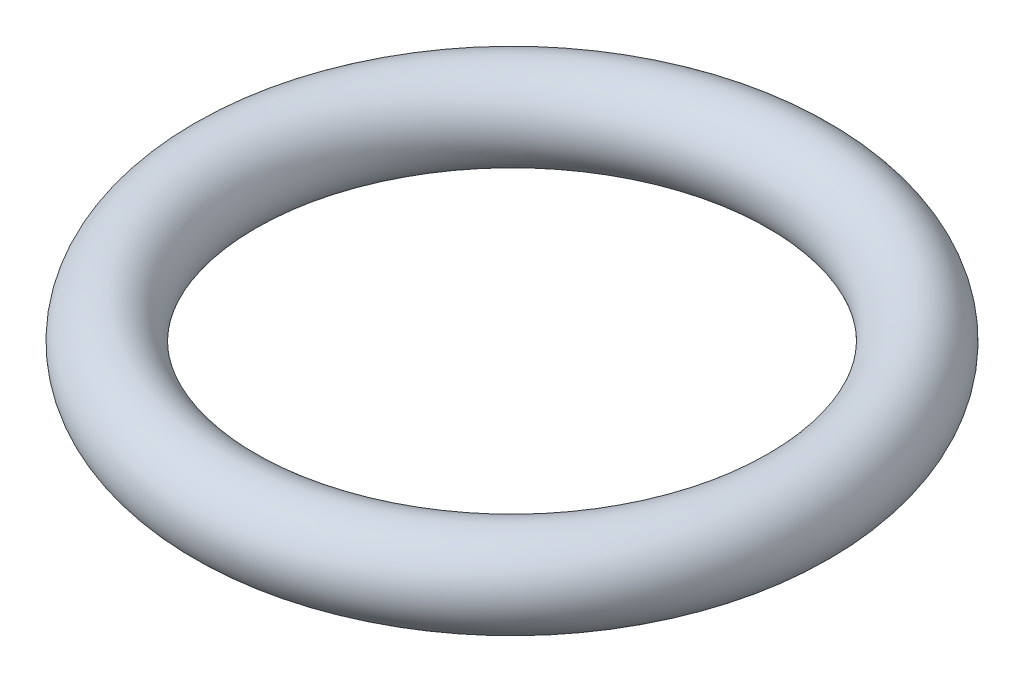
ISO-10303-21;
HEADER;
FILE_DESCRIPTION(('STEP AP214'),'2;1');
FILE_NAME('part.step','',(''),(''),'','','');
FILE_SCHEMA(('AUTOMOTIVE_DESIGN { 1 0 10303 214 1 1 1 1 }'));
ENDSEC;
DATA;
#1=APPLICATION_CONTEXT('core data for automotive mechanical design processes');
#2=APPLICATION_PROTOCOL_DEFINITION('international standard','automotive_design',2000,#1);
#3=PRODUCT_CONTEXT('',#1,'mechanical');
#4=PRODUCT('Part','Part','',(#3));
#5=PRODUCT_RELATED_PRODUCT_CATEGORY('part','',(#4));
#6=PRODUCT_DEFINITION_FORMATION('','',#4);
#7=PRODUCT_DEFINITION_CONTEXT('part definition',#1,'design');
#8=PRODUCT_DEFINITION('design','',#6,#7);
#9=PRODUCT_DEFINITION_SHAPE('','',#8);
#10=(LENGTH_UNIT() NAMED_UNIT(*) SI_UNIT(.MILLI.,.METRE.));
#11=(NAMED_UNIT(*) PLANE_ANGLE_UNIT() SI_UNIT($,.RADIAN.));
#12=(NAMED_UNIT(*) SI_UNIT($,.STERADIAN.) SOLID_ANGLE_UNIT());
#13=UNCERTAINTY_MEASURE_WITH_UNIT(LENGTH_MEASURE(1.E-05),#10,'distance_accuracy_value','');
#14=(GEOMETRIC_REPRESENTATION_CONTEXT(3) GLOBAL_UNCERTAINTY_ASSIGNED_CONTEXT((#13)) GLOBAL_UNIT_ASSIGNED_CONTEXT((#10,
#11,#12)) REPRESENTATION_CONTEXT('',''));
#15=CARTESIAN_POINT('',(0.,0.,0.));
#16=DIRECTION('',(0.,0.,1.));
#17=DIRECTION('',(1.,0.,0.));
#18=AXIS2_PLACEMENT_3D('',#15,#16,#17);
#19=CARTESIAN_POINT('',(0.,0.,0.));
#20=DIRECTION('',(0.,1.,0.));
#21=DIRECTION('',(-1.,0.,0.));
#22=AXIS2_PLACEMENT_3D('',#19,#20,#21);
#23=TOROIDAL_SURFACE('',#22,5.,0.749999999999998);
#24=CARTESIAN_POINT('',(-5.75,0.,0.));
#25=VERTEX_POINT('',#24);
#26=VERTEX_LOOP('',#25);
#27=FACE_BOUND('',#26,.T.);
#28=ADVANCED_FACE('F33',(#27),#23,.T.);
#29=CLOSED_SHELL('',(#28));
#30=MANIFOLD_SOLID_BREP('B2',#29);
#31=ADVANCED_BREP_SHAPE_REPRESENTATION('',(#18,#30),#14);
#32=SHAPE_DEFINITION_REPRESENTATION(#9,#31);
ENDSEC;
END-ISO-10303-21;
